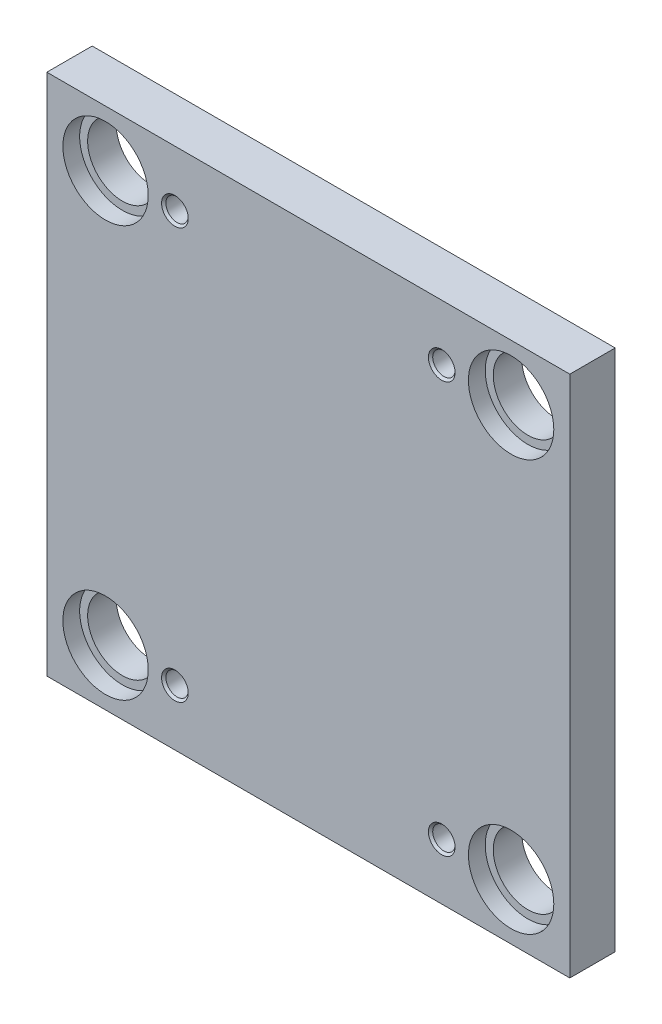
ISO-10303-21;
HEADER;
FILE_DESCRIPTION(('STEP AP214'),'2;1');
FILE_NAME('part.step','',(''),(''),'','','');
FILE_SCHEMA(('AUTOMOTIVE_DESIGN { 1 0 10303 214 1 1 1 1 }'));
ENDSEC;
DATA;
#1=APPLICATION_CONTEXT('core data for automotive mechanical design processes');
#2=APPLICATION_PROTOCOL_DEFINITION('international standard','automotive_design',2000,#1);
#3=PRODUCT_CONTEXT('',#1,'mechanical');
#4=PRODUCT('Part','Part','',(#3));
#5=PRODUCT_RELATED_PRODUCT_CATEGORY('part','',(#4));
#6=PRODUCT_DEFINITION_FORMATION('','',#4);
#7=PRODUCT_DEFINITION_CONTEXT('part definition',#1,'design');
#8=PRODUCT_DEFINITION('design','',#6,#7);
#9=PRODUCT_DEFINITION_SHAPE('','',#8);
#10=(LENGTH_UNIT() NAMED_UNIT(*) SI_UNIT(.MILLI.,.METRE.));
#11=(NAMED_UNIT(*) PLANE_ANGLE_UNIT() SI_UNIT($,.RADIAN.));
#12=(NAMED_UNIT(*) SI_UNIT($,.STERADIAN.) SOLID_ANGLE_UNIT());
#13=UNCERTAINTY_MEASURE_WITH_UNIT(LENGTH_MEASURE(1.E-05),#10,'distance_accuracy_value','');
#14=(GEOMETRIC_REPRESENTATION_CONTEXT(3) GLOBAL_UNCERTAINTY_ASSIGNED_CONTEXT((#13)) GLOBAL_UNIT_ASSIGNED_CONTEXT((#10,
#11,#12)) REPRESENTATION_CONTEXT('',''));
#15=CARTESIAN_POINT('',(0.,0.,0.));
#16=DIRECTION('',(0.,0.,1.));
#17=DIRECTION('',(1.,0.,0.));
#18=AXIS2_PLACEMENT_3D('',#15,#16,#17);
#19=CARTESIAN_POINT('',(98.,-98.,0.));
#20=DIRECTION('',(1.,0.,0.));
#21=DIRECTION('',(0.,0.,-1.));
#22=AXIS2_PLACEMENT_3D('',#19,#20,#21);
#23=PLANE('',#22);
#24=DIRECTION('',(0.,1.,0.));
#25=VECTOR('',#24,1.);
#26=CARTESIAN_POINT('',(98.,-98.,17.));
#27=LINE('',#26,#25);
#28=CARTESIAN_POINT('',(98.,-98.,17.));
#29=VERTEX_POINT('',#28);
#30=CARTESIAN_POINT('',(98.,98.,17.));
#31=VERTEX_POINT('',#30);
#32=EDGE_CURVE('E109',#29,#31,#27,.T.);
#33=ORIENTED_EDGE('',*,*,#32,.F.);
#34=DIRECTION('',(0.,0.,1.));
#35=VECTOR('',#34,1.);
#36=CARTESIAN_POINT('',(98.,-98.,0.));
#37=LINE('',#36,#35);
#38=CARTESIAN_POINT('',(98.,-98.,0.));
#39=VERTEX_POINT('',#38);
#40=EDGE_CURVE('E57',#39,#29,#37,.T.);
#41=ORIENTED_EDGE('',*,*,#40,.F.);
#42=DIRECTION('',(0.,1.,0.));
#43=VECTOR('',#42,1.);
#44=CARTESIAN_POINT('',(98.,-98.,0.));
#45=LINE('',#44,#43);
#46=CARTESIAN_POINT('',(98.,98.,0.));
#47=VERTEX_POINT('',#46);
#48=EDGE_CURVE('E102',#39,#47,#45,.T.);
#49=ORIENTED_EDGE('',*,*,#48,.T.);
#50=DIRECTION('',(0.,0.,1.));
#51=VECTOR('',#50,1.);
#52=CARTESIAN_POINT('',(98.,98.,0.));
#53=LINE('',#52,#51);
#54=EDGE_CURVE('E85',#47,#31,#53,.T.);
#55=ORIENTED_EDGE('',*,*,#54,.T.);
#56=EDGE_LOOP('',(#33,#41,#49,#55));
#57=FACE_BOUND('',#56,.T.);
#58=ADVANCED_FACE('F39',(#57),#23,.T.);
#59=CARTESIAN_POINT('',(-98.,-98.,0.));
#60=DIRECTION('',(0.,-1.,0.));
#61=DIRECTION('',(0.,0.,-1.));
#62=AXIS2_PLACEMENT_3D('',#59,#60,#61);
#63=PLANE('',#62);
#64=DIRECTION('',(1.,0.,0.));
#65=VECTOR('',#64,1.);
#66=CARTESIAN_POINT('',(-98.,-98.,17.));
#67=LINE('',#66,#65);
#68=CARTESIAN_POINT('',(-98.,-98.,17.));
#69=VERTEX_POINT('',#68);
#70=EDGE_CURVE('E104',#69,#29,#67,.T.);
#71=ORIENTED_EDGE('',*,*,#70,.F.);
#72=DIRECTION('',(0.,0.,1.));
#73=VECTOR('',#72,1.);
#74=CARTESIAN_POINT('',(-98.,-98.,0.));
#75=LINE('',#74,#73);
#76=CARTESIAN_POINT('',(-98.,-98.,0.));
#77=VERTEX_POINT('',#76);
#78=EDGE_CURVE('E74',#77,#69,#75,.T.);
#79=ORIENTED_EDGE('',*,*,#78,.F.);
#80=DIRECTION('',(1.,0.,0.));
#81=VECTOR('',#80,1.);
#82=CARTESIAN_POINT('',(-98.,-98.,0.));
#83=LINE('',#82,#81);
#84=EDGE_CURVE('E99',#77,#39,#83,.T.);
#85=ORIENTED_EDGE('',*,*,#84,.T.);
#86=ORIENTED_EDGE('',*,*,#40,.T.);
#87=EDGE_LOOP('',(#71,#79,#85,#86));
#88=FACE_BOUND('',#87,.T.);
#89=ADVANCED_FACE('F159',(#88),#63,.T.);
#90=CARTESIAN_POINT('',(-98.,98.,0.));
#91=DIRECTION('',(-1.,0.,0.));
#92=DIRECTION('',(0.,0.,1.));
#93=AXIS2_PLACEMENT_3D('',#90,#91,#92);
#94=PLANE('',#93);
#95=DIRECTION('',(0.,-1.,0.));
#96=VECTOR('',#95,1.);
#97=CARTESIAN_POINT('',(-98.,98.,17.));
#98=LINE('',#97,#96);
#99=CARTESIAN_POINT('',(-98.,98.,17.));
#100=VERTEX_POINT('',#99);
#101=EDGE_CURVE('E93',#100,#69,#98,.T.);
#102=ORIENTED_EDGE('',*,*,#101,.F.);
#103=DIRECTION('',(0.,0.,1.));
#104=VECTOR('',#103,1.);
#105=CARTESIAN_POINT('',(-98.,98.,0.));
#106=LINE('',#105,#104);
#107=CARTESIAN_POINT('',(-98.,98.,0.));
#108=VERTEX_POINT('',#107);
#109=EDGE_CURVE('E88',#108,#100,#106,.T.);
#110=ORIENTED_EDGE('',*,*,#109,.F.);
#111=DIRECTION('',(0.,-1.,0.));
#112=VECTOR('',#111,1.);
#113=CARTESIAN_POINT('',(-98.,98.,0.));
#114=LINE('',#113,#112);
#115=EDGE_CURVE('E91',#108,#77,#114,.T.);
#116=ORIENTED_EDGE('',*,*,#115,.T.);
#117=ORIENTED_EDGE('',*,*,#78,.T.);
#118=EDGE_LOOP('',(#102,#110,#116,#117));
#119=FACE_BOUND('',#118,.T.);
#120=ADVANCED_FACE('F90',(#119),#94,.T.);
#121=CARTESIAN_POINT('',(98.,98.,0.));
#122=DIRECTION('',(0.,1.,0.));
#123=DIRECTION('',(0.,0.,1.));
#124=AXIS2_PLACEMENT_3D('',#121,#122,#123);
#125=PLANE('',#124);
#126=DIRECTION('',(-1.,0.,0.));
#127=VECTOR('',#126,1.);
#128=CARTESIAN_POINT('',(98.,98.,17.));
#129=LINE('',#128,#127);
#130=EDGE_CURVE('E112',#31,#100,#129,.T.);
#131=ORIENTED_EDGE('',*,*,#130,.F.);
#132=ORIENTED_EDGE('',*,*,#54,.F.);
#133=DIRECTION('',(-1.,0.,0.));
#134=VECTOR('',#133,1.);
#135=CARTESIAN_POINT('',(98.,98.,0.));
#136=LINE('',#135,#134);
#137=EDGE_CURVE('E98',#47,#108,#136,.T.);
#138=ORIENTED_EDGE('',*,*,#137,.T.);
#139=ORIENTED_EDGE('',*,*,#109,.T.);
#140=EDGE_LOOP('',(#131,#132,#138,#139));
#141=FACE_BOUND('',#140,.T.);
#142=ADVANCED_FACE('F101',(#141),#125,.T.);
#143=CARTESIAN_POINT('',(0.,0.,0.));
#144=DIRECTION('',(0.,0.,1.));
#145=DIRECTION('',(1.,0.,0.));
#146=AXIS2_PLACEMENT_3D('',#143,#144,#145);
#147=PLANE('',#146);
#148=CARTESIAN_POINT('',(76.,-77.,0.));
#149=DIRECTION('',(0.,0.,1.));
#150=DIRECTION('',(1.,0.,0.));
#151=AXIS2_PLACEMENT_3D('',#148,#149,#150);
#152=CIRCLE('',#151,13.);
#153=CARTESIAN_POINT('',(89.,-77.,0.));
#154=VERTEX_POINT('',#153);
#155=EDGE_CURVE('E246',#154,#154,#152,.T.);
#156=ORIENTED_EDGE('',*,*,#155,.T.);
#157=EDGE_LOOP('',(#156));
#158=FACE_BOUND('',#157,.T.);
#159=CARTESIAN_POINT('',(-76.,-77.,0.));
#160=DIRECTION('',(0.,0.,1.));
#161=DIRECTION('',(1.,0.,0.));
#162=AXIS2_PLACEMENT_3D('',#159,#160,#161);
#163=CIRCLE('',#162,13.);
#164=CARTESIAN_POINT('',(-63.,-77.,0.));
#165=VERTEX_POINT('',#164);
#166=EDGE_CURVE('E234',#165,#165,#163,.T.);
#167=ORIENTED_EDGE('',*,*,#166,.T.);
#168=EDGE_LOOP('',(#167));
#169=FACE_BOUND('',#168,.T.);
#170=CARTESIAN_POINT('',(76.,77.,0.));
#171=DIRECTION('',(0.,0.,1.));
#172=DIRECTION('',(1.,0.,0.));
#173=AXIS2_PLACEMENT_3D('',#170,#171,#172);
#174=CIRCLE('',#173,13.);
#175=CARTESIAN_POINT('',(89.,77.,0.));
#176=VERTEX_POINT('',#175);
#177=EDGE_CURVE('E222',#176,#176,#174,.T.);
#178=ORIENTED_EDGE('',*,*,#177,.T.);
#179=EDGE_LOOP('',(#178));
#180=FACE_BOUND('',#179,.T.);
#181=CARTESIAN_POINT('',(-76.,77.,0.));
#182=DIRECTION('',(0.,0.,1.));
#183=DIRECTION('',(1.,0.,0.));
#184=AXIS2_PLACEMENT_3D('',#181,#182,#183);
#185=CIRCLE('',#184,13.);
#186=CARTESIAN_POINT('',(-63.,77.,0.));
#187=VERTEX_POINT('',#186);
#188=EDGE_CURVE('E210',#187,#187,#185,.T.);
#189=ORIENTED_EDGE('',*,*,#188,.T.);
#190=EDGE_LOOP('',(#189));
#191=FACE_BOUND('',#190,.T.);
#192=CARTESIAN_POINT('',(-50.,77.,0.));
#193=DIRECTION('',(0.,0.,1.));
#194=DIRECTION('',(1.,0.,0.));
#195=AXIS2_PLACEMENT_3D('',#192,#193,#194);
#196=CIRCLE('',#195,4.18800000000002);
#197=CARTESIAN_POINT('',(-45.812,77.,0.));
#198=VERTEX_POINT('',#197);
#199=EDGE_CURVE('E207',#198,#198,#196,.T.);
#200=ORIENTED_EDGE('',*,*,#199,.T.);
#201=EDGE_LOOP('',(#200));
#202=FACE_BOUND('',#201,.T.);
#203=CARTESIAN_POINT('',(-50.,-77.,0.));
#204=DIRECTION('',(0.,0.,1.));
#205=DIRECTION('',(1.,0.,0.));
#206=AXIS2_PLACEMENT_3D('',#203,#204,#205);
#207=CIRCLE('',#206,4.18800000000002);
#208=CARTESIAN_POINT('',(-45.812,-77.,0.));
#209=VERTEX_POINT('',#208);
#210=EDGE_CURVE('E202',#209,#209,#207,.T.);
#211=ORIENTED_EDGE('',*,*,#210,.T.);
#212=EDGE_LOOP('',(#211));
#213=FACE_BOUND('',#212,.T.);
#214=CARTESIAN_POINT('',(50.,77.,0.));
#215=DIRECTION('',(0.,0.,1.));
#216=DIRECTION('',(1.,0.,0.));
#217=AXIS2_PLACEMENT_3D('',#214,#215,#216);
#218=CIRCLE('',#217,4.18800000000002);
#219=CARTESIAN_POINT('',(54.188,77.,0.));
#220=VERTEX_POINT('',#219);
#221=EDGE_CURVE('E200',#220,#220,#218,.T.);
#222=ORIENTED_EDGE('',*,*,#221,.T.);
#223=EDGE_LOOP('',(#222));
#224=FACE_BOUND('',#223,.T.);
#225=CARTESIAN_POINT('',(50.,-77.,0.));
#226=DIRECTION('',(0.,0.,1.));
#227=DIRECTION('',(1.,0.,0.));
#228=AXIS2_PLACEMENT_3D('',#225,#226,#227);
#229=CIRCLE('',#228,4.18800000000002);
#230=CARTESIAN_POINT('',(54.188,-77.,0.));
#231=VERTEX_POINT('',#230);
#232=EDGE_CURVE('E113',#231,#231,#229,.T.);
#233=ORIENTED_EDGE('',*,*,#232,.T.);
#234=EDGE_LOOP('',(#233));
#235=FACE_BOUND('',#234,.T.);
#236=ORIENTED_EDGE('',*,*,#48,.F.);
#237=ORIENTED_EDGE('',*,*,#84,.F.);
#238=ORIENTED_EDGE('',*,*,#115,.F.);
#239=ORIENTED_EDGE('',*,*,#137,.F.);
#240=EDGE_LOOP('',(#236,#237,#238,#239));
#241=FACE_BOUND('',#240,.T.);
#242=ADVANCED_FACE('F97',(#158,#169,#180,#191,#202,#213,#224,#235,#241),#147,.F.);
#243=CARTESIAN_POINT('',(0.,0.,17.));
#244=DIRECTION('',(0.,0.,1.));
#245=DIRECTION('',(1.,0.,0.));
#246=AXIS2_PLACEMENT_3D('',#243,#244,#245);
#247=PLANE('',#246);
#248=CARTESIAN_POINT('',(50.,-77.,17.));
#249=DIRECTION('',(0.,0.,1.));
#250=DIRECTION('',(1.,0.,0.));
#251=AXIS2_PLACEMENT_3D('',#248,#249,#250);
#252=CIRCLE('',#251,5.00000000000003);
#253=CARTESIAN_POINT('',(55.,-77.,17.));
#254=VERTEX_POINT('',#253);
#255=EDGE_CURVE('E133',#254,#254,#252,.F.);
#256=ORIENTED_EDGE('',*,*,#255,.T.);
#257=EDGE_LOOP('',(#256));
#258=FACE_BOUND('',#257,.T.);
#259=CARTESIAN_POINT('',(50.,77.,17.));
#260=DIRECTION('',(0.,0.,1.));
#261=DIRECTION('',(1.,0.,0.));
#262=AXIS2_PLACEMENT_3D('',#259,#260,#261);
#263=CIRCLE('',#262,5.00000000000003);
#264=CARTESIAN_POINT('',(55.,77.,17.));
#265=VERTEX_POINT('',#264);
#266=EDGE_CURVE('E130',#265,#265,#263,.F.);
#267=ORIENTED_EDGE('',*,*,#266,.T.);
#268=EDGE_LOOP('',(#267));
#269=FACE_BOUND('',#268,.T.);
#270=CARTESIAN_POINT('',(-50.,77.,17.));
#271=DIRECTION('',(0.,0.,1.));
#272=DIRECTION('',(1.,0.,0.));
#273=AXIS2_PLACEMENT_3D('',#270,#271,#272);
#274=CIRCLE('',#273,5.00000000000003);
#275=CARTESIAN_POINT('',(-45.,77.,17.));
#276=VERTEX_POINT('',#275);
#277=EDGE_CURVE('E127',#276,#276,#274,.F.);
#278=ORIENTED_EDGE('',*,*,#277,.T.);
#279=EDGE_LOOP('',(#278));
#280=FACE_BOUND('',#279,.T.);
#281=CARTESIAN_POINT('',(-50.,-77.,17.));
#282=DIRECTION('',(0.,0.,1.));
#283=DIRECTION('',(1.,0.,0.));
#284=AXIS2_PLACEMENT_3D('',#281,#282,#283);
#285=CIRCLE('',#284,5.00000000000003);
#286=CARTESIAN_POINT('',(-45.,-77.,17.));
#287=VERTEX_POINT('',#286);
#288=EDGE_CURVE('E124',#287,#287,#285,.F.);
#289=ORIENTED_EDGE('',*,*,#288,.T.);
#290=EDGE_LOOP('',(#289));
#291=FACE_BOUND('',#290,.T.);
#292=CARTESIAN_POINT('',(76.,-77.,17.));
#293=DIRECTION('',(0.,0.,1.));
#294=DIRECTION('',(1.,0.,0.));
#295=AXIS2_PLACEMENT_3D('',#292,#293,#294);
#296=CIRCLE('',#295,16.);
#297=CARTESIAN_POINT('',(92.,-77.,17.));
#298=VERTEX_POINT('',#297);
#299=EDGE_CURVE('E255',#298,#298,#296,.T.);
#300=ORIENTED_EDGE('',*,*,#299,.F.);
#301=EDGE_LOOP('',(#300));
#302=FACE_BOUND('',#301,.T.);
#303=CARTESIAN_POINT('',(-76.,-77.,17.));
#304=DIRECTION('',(0.,0.,1.));
#305=DIRECTION('',(1.,0.,0.));
#306=AXIS2_PLACEMENT_3D('',#303,#304,#305);
#307=CIRCLE('',#306,16.);
#308=CARTESIAN_POINT('',(-60.,-77.,17.));
#309=VERTEX_POINT('',#308);
#310=EDGE_CURVE('E243',#309,#309,#307,.T.);
#311=ORIENTED_EDGE('',*,*,#310,.F.);
#312=EDGE_LOOP('',(#311));
#313=FACE_BOUND('',#312,.T.);
#314=CARTESIAN_POINT('',(76.,77.,17.));
#315=DIRECTION('',(0.,0.,1.));
#316=DIRECTION('',(1.,0.,0.));
#317=AXIS2_PLACEMENT_3D('',#314,#315,#316);
#318=CIRCLE('',#317,16.);
#319=CARTESIAN_POINT('',(92.,77.,17.));
#320=VERTEX_POINT('',#319);
#321=EDGE_CURVE('E231',#320,#320,#318,.T.);
#322=ORIENTED_EDGE('',*,*,#321,.F.);
#323=EDGE_LOOP('',(#322));
#324=FACE_BOUND('',#323,.T.);
#325=CARTESIAN_POINT('',(-76.,77.,17.));
#326=DIRECTION('',(0.,0.,1.));
#327=DIRECTION('',(1.,0.,0.));
#328=AXIS2_PLACEMENT_3D('',#325,#326,#327);
#329=CIRCLE('',#328,16.);
#330=CARTESIAN_POINT('',(-60.,77.,17.));
#331=VERTEX_POINT('',#330);
#332=EDGE_CURVE('E219',#331,#331,#329,.T.);
#333=ORIENTED_EDGE('',*,*,#332,.F.);
#334=EDGE_LOOP('',(#333));
#335=FACE_BOUND('',#334,.T.);
#336=ORIENTED_EDGE('',*,*,#32,.T.);
#337=ORIENTED_EDGE('',*,*,#130,.T.);
#338=ORIENTED_EDGE('',*,*,#101,.T.);
#339=ORIENTED_EDGE('',*,*,#70,.T.);
#340=EDGE_LOOP('',(#336,#337,#338,#339));
#341=FACE_BOUND('',#340,.T.);
#342=ADVANCED_FACE('F195',(#258,#269,#280,#291,#302,#313,#324,#335,#341),#247,.T.);
#343=CARTESIAN_POINT('',(50.,-77.,17.));
#344=DIRECTION('',(0.,0.,1.));
#345=DIRECTION('',(1.,0.,0.));
#346=AXIS2_PLACEMENT_3D('',#343,#344,#345);
#347=CYLINDRICAL_SURFACE('',#346,4.18800000000002);
#348=CARTESIAN_POINT('',(50.,-77.,16.188));
#349=DIRECTION('',(0.,0.,1.));
#350=DIRECTION('',(1.,0.,0.));
#351=AXIS2_PLACEMENT_3D('',#348,#349,#350);
#352=CIRCLE('',#351,4.18800000000002);
#353=CARTESIAN_POINT('',(54.188,-77.,16.188));
#354=VERTEX_POINT('',#353);
#355=EDGE_CURVE('E119',#354,#354,#352,.T.);
#356=ORIENTED_EDGE('',*,*,#355,.T.);
#357=EDGE_LOOP('',(#356));
#358=FACE_BOUND('',#357,.T.);
#359=ORIENTED_EDGE('',*,*,#232,.F.);
#360=EDGE_LOOP('',(#359));
#361=FACE_BOUND('',#360,.T.);
#362=ADVANCED_FACE('F191',(#358,#361),#347,.F.);
#363=CARTESIAN_POINT('',(50.,77.,17.));
#364=DIRECTION('',(0.,0.,1.));
#365=DIRECTION('',(1.,0.,0.));
#366=AXIS2_PLACEMENT_3D('',#363,#364,#365);
#367=CYLINDRICAL_SURFACE('',#366,4.18800000000002);
#368=CARTESIAN_POINT('',(50.,77.,16.188));
#369=DIRECTION('',(0.,0.,1.));
#370=DIRECTION('',(1.,0.,0.));
#371=AXIS2_PLACEMENT_3D('',#368,#369,#370);
#372=CIRCLE('',#371,4.18800000000002);
#373=CARTESIAN_POINT('',(54.188,77.,16.188));
#374=VERTEX_POINT('',#373);
#375=EDGE_CURVE('E136',#374,#374,#372,.T.);
#376=ORIENTED_EDGE('',*,*,#375,.T.);
#377=EDGE_LOOP('',(#376));
#378=FACE_BOUND('',#377,.T.);
#379=ORIENTED_EDGE('',*,*,#221,.F.);
#380=EDGE_LOOP('',(#379));
#381=FACE_BOUND('',#380,.T.);
#382=ADVANCED_FACE('F194',(#378,#381),#367,.F.);
#383=CARTESIAN_POINT('',(-50.,-77.,17.));
#384=DIRECTION('',(0.,0.,1.));
#385=DIRECTION('',(1.,0.,0.));
#386=AXIS2_PLACEMENT_3D('',#383,#384,#385);
#387=CYLINDRICAL_SURFACE('',#386,4.18800000000002);
#388=CARTESIAN_POINT('',(-50.,-77.,16.188));
#389=DIRECTION('',(0.,0.,1.));
#390=DIRECTION('',(1.,0.,0.));
#391=AXIS2_PLACEMENT_3D('',#388,#389,#390);
#392=CIRCLE('',#391,4.18800000000002);
#393=CARTESIAN_POINT('',(-45.812,-77.,16.188));
#394=VERTEX_POINT('',#393);
#395=EDGE_CURVE('E11',#394,#394,#392,.T.);
#396=ORIENTED_EDGE('',*,*,#395,.T.);
#397=EDGE_LOOP('',(#396));
#398=FACE_BOUND('',#397,.T.);
#399=ORIENTED_EDGE('',*,*,#210,.F.);
#400=EDGE_LOOP('',(#399));
#401=FACE_BOUND('',#400,.T.);
#402=ADVANCED_FACE('F295',(#398,#401),#387,.F.);
#403=CARTESIAN_POINT('',(-50.,77.,17.));
#404=DIRECTION('',(0.,0.,1.));
#405=DIRECTION('',(1.,0.,0.));
#406=AXIS2_PLACEMENT_3D('',#403,#404,#405);
#407=CYLINDRICAL_SURFACE('',#406,4.18800000000002);
#408=CARTESIAN_POINT('',(-50.,77.,16.188));
#409=DIRECTION('',(0.,0.,1.));
#410=DIRECTION('',(1.,0.,0.));
#411=AXIS2_PLACEMENT_3D('',#408,#409,#410);
#412=CIRCLE('',#411,4.18800000000002);
#413=CARTESIAN_POINT('',(-45.812,77.,16.188));
#414=VERTEX_POINT('',#413);
#415=EDGE_CURVE('E49',#414,#414,#412,.T.);
#416=ORIENTED_EDGE('',*,*,#415,.T.);
#417=EDGE_LOOP('',(#416));
#418=FACE_BOUND('',#417,.T.);
#419=ORIENTED_EDGE('',*,*,#199,.F.);
#420=EDGE_LOOP('',(#419));
#421=FACE_BOUND('',#420,.T.);
#422=ADVANCED_FACE('F141',(#418,#421),#407,.F.);
#423=CARTESIAN_POINT('',(-76.,77.,17.));
#424=DIRECTION('',(0.,0.,1.));
#425=DIRECTION('',(1.,0.,0.));
#426=AXIS2_PLACEMENT_3D('',#423,#424,#425);
#427=CYLINDRICAL_SURFACE('',#426,13.);
#428=ORIENTED_EDGE('',*,*,#188,.F.);
#429=EDGE_LOOP('',(#428));
#430=FACE_BOUND('',#429,.T.);
#431=CARTESIAN_POINT('',(-76.,77.,10.7));
#432=DIRECTION('',(0.,0.,1.));
#433=DIRECTION('',(1.,0.,0.));
#434=AXIS2_PLACEMENT_3D('',#431,#432,#433);
#435=CIRCLE('',#434,13.);
#436=CARTESIAN_POINT('',(-63.,77.,10.7));
#437=VERTEX_POINT('',#436);
#438=EDGE_CURVE('E213',#437,#437,#435,.T.);
#439=ORIENTED_EDGE('',*,*,#438,.T.);
#440=EDGE_LOOP('',(#439));
#441=FACE_BOUND('',#440,.T.);
#442=ADVANCED_FACE('F284',(#430,#441),#427,.F.);
#443=CARTESIAN_POINT('',(-63.,77.,10.7));
#444=DIRECTION('',(0.,0.,-1.));
#445=DIRECTION('',(-1.,0.,0.));
#446=AXIS2_PLACEMENT_3D('',#443,#444,#445);
#447=PLANE('',#446);
#448=ORIENTED_EDGE('',*,*,#438,.F.);
#449=EDGE_LOOP('',(#448));
#450=FACE_BOUND('',#449,.T.);
#451=CARTESIAN_POINT('',(-76.,77.,10.7));
#452=DIRECTION('',(0.,0.,1.));
#453=DIRECTION('',(1.,0.,0.));
#454=AXIS2_PLACEMENT_3D('',#451,#452,#453);
#455=CIRCLE('',#454,16.);
#456=CARTESIAN_POINT('',(-60.,77.,10.7));
#457=VERTEX_POINT('',#456);
#458=EDGE_CURVE('E216',#457,#457,#455,.T.);
#459=ORIENTED_EDGE('',*,*,#458,.T.);
#460=EDGE_LOOP('',(#459));
#461=FACE_BOUND('',#460,.T.);
#462=ADVANCED_FACE('F274',(#450,#461),#447,.F.);
#463=CARTESIAN_POINT('',(-76.,77.,17.));
#464=DIRECTION('',(0.,0.,1.));
#465=DIRECTION('',(1.,0.,0.));
#466=AXIS2_PLACEMENT_3D('',#463,#464,#465);
#467=CYLINDRICAL_SURFACE('',#466,16.);
#468=ORIENTED_EDGE('',*,*,#458,.F.);
#469=EDGE_LOOP('',(#468));
#470=FACE_BOUND('',#469,.T.);
#471=ORIENTED_EDGE('',*,*,#332,.T.);
#472=EDGE_LOOP('',(#471));
#473=FACE_BOUND('',#472,.T.);
#474=ADVANCED_FACE('F271',(#470,#473),#467,.F.);
#475=CARTESIAN_POINT('',(76.,77.,17.));
#476=DIRECTION('',(0.,0.,1.));
#477=DIRECTION('',(1.,0.,0.));
#478=AXIS2_PLACEMENT_3D('',#475,#476,#477);
#479=CYLINDRICAL_SURFACE('',#478,13.);
#480=ORIENTED_EDGE('',*,*,#177,.F.);
#481=EDGE_LOOP('',(#480));
#482=FACE_BOUND('',#481,.T.);
#483=CARTESIAN_POINT('',(76.,77.,10.7));
#484=DIRECTION('',(0.,0.,1.));
#485=DIRECTION('',(1.,0.,0.));
#486=AXIS2_PLACEMENT_3D('',#483,#484,#485);
#487=CIRCLE('',#486,13.);
#488=CARTESIAN_POINT('',(89.,77.,10.7));
#489=VERTEX_POINT('',#488);
#490=EDGE_CURVE('E225',#489,#489,#487,.T.);
#491=ORIENTED_EDGE('',*,*,#490,.T.);
#492=EDGE_LOOP('',(#491));
#493=FACE_BOUND('',#492,.T.);
#494=ADVANCED_FACE('F273',(#482,#493),#479,.F.);
#495=CARTESIAN_POINT('',(89.,77.,10.7));
#496=DIRECTION('',(0.,0.,-1.));
#497=DIRECTION('',(-1.,0.,0.));
#498=AXIS2_PLACEMENT_3D('',#495,#496,#497);
#499=PLANE('',#498);
#500=ORIENTED_EDGE('',*,*,#490,.F.);
#501=EDGE_LOOP('',(#500));
#502=FACE_BOUND('',#501,.T.);
#503=CARTESIAN_POINT('',(76.,77.,10.7));
#504=DIRECTION('',(0.,0.,1.));
#505=DIRECTION('',(1.,0.,0.));
#506=AXIS2_PLACEMENT_3D('',#503,#504,#505);
#507=CIRCLE('',#506,16.);
#508=CARTESIAN_POINT('',(92.,77.,10.7));
#509=VERTEX_POINT('',#508);
#510=EDGE_CURVE('E228',#509,#509,#507,.T.);
#511=ORIENTED_EDGE('',*,*,#510,.T.);
#512=EDGE_LOOP('',(#511));
#513=FACE_BOUND('',#512,.T.);
#514=ADVANCED_FACE('F281',(#502,#513),#499,.F.);
#515=CARTESIAN_POINT('',(76.,77.,17.));
#516=DIRECTION('',(0.,0.,1.));
#517=DIRECTION('',(1.,0.,0.));
#518=AXIS2_PLACEMENT_3D('',#515,#516,#517);
#519=CYLINDRICAL_SURFACE('',#518,16.);
#520=ORIENTED_EDGE('',*,*,#510,.F.);
#521=EDGE_LOOP('',(#520));
#522=FACE_BOUND('',#521,.T.);
#523=ORIENTED_EDGE('',*,*,#321,.T.);
#524=EDGE_LOOP('',(#523));
#525=FACE_BOUND('',#524,.T.);
#526=ADVANCED_FACE('F362',(#522,#525),#519,.F.);
#527=CARTESIAN_POINT('',(-76.,-77.,17.));
#528=DIRECTION('',(0.,0.,1.));
#529=DIRECTION('',(1.,0.,0.));
#530=AXIS2_PLACEMENT_3D('',#527,#528,#529);
#531=CYLINDRICAL_SURFACE('',#530,13.);
#532=ORIENTED_EDGE('',*,*,#166,.F.);
#533=EDGE_LOOP('',(#532));
#534=FACE_BOUND('',#533,.T.);
#535=CARTESIAN_POINT('',(-76.,-77.,10.7));
#536=DIRECTION('',(0.,0.,1.));
#537=DIRECTION('',(1.,0.,0.));
#538=AXIS2_PLACEMENT_3D('',#535,#536,#537);
#539=CIRCLE('',#538,13.);
#540=CARTESIAN_POINT('',(-63.,-77.,10.7));
#541=VERTEX_POINT('',#540);
#542=EDGE_CURVE('E237',#541,#541,#539,.T.);
#543=ORIENTED_EDGE('',*,*,#542,.T.);
#544=EDGE_LOOP('',(#543));
#545=FACE_BOUND('',#544,.T.);
#546=ADVANCED_FACE('F371',(#534,#545),#531,.F.);
#547=CARTESIAN_POINT('',(-63.,-77.,10.7));
#548=DIRECTION('',(0.,0.,-1.));
#549=DIRECTION('',(-1.,0.,0.));
#550=AXIS2_PLACEMENT_3D('',#547,#548,#549);
#551=PLANE('',#550);
#552=ORIENTED_EDGE('',*,*,#542,.F.);
#553=EDGE_LOOP('',(#552));
#554=FACE_BOUND('',#553,.T.);
#555=CARTESIAN_POINT('',(-76.,-77.,10.7));
#556=DIRECTION('',(0.,0.,1.));
#557=DIRECTION('',(1.,0.,0.));
#558=AXIS2_PLACEMENT_3D('',#555,#556,#557);
#559=CIRCLE('',#558,16.);
#560=CARTESIAN_POINT('',(-60.,-77.,10.7));
#561=VERTEX_POINT('',#560);
#562=EDGE_CURVE('E240',#561,#561,#559,.T.);
#563=ORIENTED_EDGE('',*,*,#562,.T.);
#564=EDGE_LOOP('',(#563));
#565=FACE_BOUND('',#564,.T.);
#566=ADVANCED_FACE('F381',(#554,#565),#551,.F.);
#567=CARTESIAN_POINT('',(-76.,-77.,17.));
#568=DIRECTION('',(0.,0.,1.));
#569=DIRECTION('',(1.,0.,0.));
#570=AXIS2_PLACEMENT_3D('',#567,#568,#569);
#571=CYLINDRICAL_SURFACE('',#570,16.);
#572=ORIENTED_EDGE('',*,*,#562,.F.);
#573=EDGE_LOOP('',(#572));
#574=FACE_BOUND('',#573,.T.);
#575=ORIENTED_EDGE('',*,*,#310,.T.);
#576=EDGE_LOOP('',(#575));
#577=FACE_BOUND('',#576,.T.);
#578=ADVANCED_FACE('F391',(#574,#577),#571,.F.);
#579=CARTESIAN_POINT('',(76.,-77.,17.));
#580=DIRECTION('',(0.,0.,1.));
#581=DIRECTION('',(1.,0.,0.));
#582=AXIS2_PLACEMENT_3D('',#579,#580,#581);
#583=CYLINDRICAL_SURFACE('',#582,13.);
#584=ORIENTED_EDGE('',*,*,#155,.F.);
#585=EDGE_LOOP('',(#584));
#586=FACE_BOUND('',#585,.T.);
#587=CARTESIAN_POINT('',(76.,-77.,10.7));
#588=DIRECTION('',(0.,0.,1.));
#589=DIRECTION('',(1.,0.,0.));
#590=AXIS2_PLACEMENT_3D('',#587,#588,#589);
#591=CIRCLE('',#590,13.);
#592=CARTESIAN_POINT('',(89.,-77.,10.7));
#593=VERTEX_POINT('',#592);
#594=EDGE_CURVE('E249',#593,#593,#591,.T.);
#595=ORIENTED_EDGE('',*,*,#594,.T.);
#596=EDGE_LOOP('',(#595));
#597=FACE_BOUND('',#596,.T.);
#598=ADVANCED_FACE('F401',(#586,#597),#583,.F.);
#599=CARTESIAN_POINT('',(89.,-77.,10.7));
#600=DIRECTION('',(0.,0.,-1.));
#601=DIRECTION('',(-1.,0.,0.));
#602=AXIS2_PLACEMENT_3D('',#599,#600,#601);
#603=PLANE('',#602);
#604=ORIENTED_EDGE('',*,*,#594,.F.);
#605=EDGE_LOOP('',(#604));
#606=FACE_BOUND('',#605,.T.);
#607=CARTESIAN_POINT('',(76.,-77.,10.7));
#608=DIRECTION('',(0.,0.,1.));
#609=DIRECTION('',(1.,0.,0.));
#610=AXIS2_PLACEMENT_3D('',#607,#608,#609);
#611=CIRCLE('',#610,16.);
#612=CARTESIAN_POINT('',(92.,-77.,10.7));
#613=VERTEX_POINT('',#612);
#614=EDGE_CURVE('E252',#613,#613,#611,.T.);
#615=ORIENTED_EDGE('',*,*,#614,.T.);
#616=EDGE_LOOP('',(#615));
#617=FACE_BOUND('',#616,.T.);
#618=ADVANCED_FACE('F184',(#606,#617),#603,.F.);
#619=CARTESIAN_POINT('',(76.,-77.,17.));
#620=DIRECTION('',(0.,0.,1.));
#621=DIRECTION('',(1.,0.,0.));
#622=AXIS2_PLACEMENT_3D('',#619,#620,#621);
#623=CYLINDRICAL_SURFACE('',#622,16.);
#624=ORIENTED_EDGE('',*,*,#614,.F.);
#625=EDGE_LOOP('',(#624));
#626=FACE_BOUND('',#625,.T.);
#627=ORIENTED_EDGE('',*,*,#299,.T.);
#628=EDGE_LOOP('',(#627));
#629=FACE_BOUND('',#628,.T.);
#630=ADVANCED_FACE('F173',(#626,#629),#623,.F.);
#631=CARTESIAN_POINT('',(50.,-77.,16.188));
#632=DIRECTION('',(0.,0.,1.));
#633=DIRECTION('',(1.,0.,0.));
#634=AXIS2_PLACEMENT_3D('',#631,#632,#633);
#635=CONICAL_SURFACE('',#634,4.18800000000002,0.785398163397444);
#636=ORIENTED_EDGE('',*,*,#255,.F.);
#637=EDGE_LOOP('',(#636));
#638=FACE_BOUND('',#637,.T.);
#639=ORIENTED_EDGE('',*,*,#355,.F.);
#640=EDGE_LOOP('',(#639));
#641=FACE_BOUND('',#640,.T.);
#642=ADVANCED_FACE('F153',(#638,#641),#635,.F.);
#643=CARTESIAN_POINT('',(50.,77.,16.188));
#644=DIRECTION('',(0.,0.,1.));
#645=DIRECTION('',(1.,0.,0.));
#646=AXIS2_PLACEMENT_3D('',#643,#644,#645);
#647=CONICAL_SURFACE('',#646,4.18800000000002,0.785398163397444);
#648=ORIENTED_EDGE('',*,*,#266,.F.);
#649=EDGE_LOOP('',(#648));
#650=FACE_BOUND('',#649,.T.);
#651=ORIENTED_EDGE('',*,*,#375,.F.);
#652=EDGE_LOOP('',(#651));
#653=FACE_BOUND('',#652,.T.);
#654=ADVANCED_FACE('F146',(#650,#653),#647,.F.);
#655=CARTESIAN_POINT('',(-50.,77.,16.188));
#656=DIRECTION('',(0.,0.,1.));
#657=DIRECTION('',(1.,0.,0.));
#658=AXIS2_PLACEMENT_3D('',#655,#656,#657);
#659=CONICAL_SURFACE('',#658,4.18800000000002,0.785398163397444);
#660=ORIENTED_EDGE('',*,*,#277,.F.);
#661=EDGE_LOOP('',(#660));
#662=FACE_BOUND('',#661,.T.);
#663=ORIENTED_EDGE('',*,*,#415,.F.);
#664=EDGE_LOOP('',(#663));
#665=FACE_BOUND('',#664,.T.);
#666=ADVANCED_FACE('F144',(#662,#665),#659,.F.);
#667=CARTESIAN_POINT('',(-50.,-77.,16.188));
#668=DIRECTION('',(0.,0.,1.));
#669=DIRECTION('',(1.,0.,0.));
#670=AXIS2_PLACEMENT_3D('',#667,#668,#669);
#671=CONICAL_SURFACE('',#670,4.18800000000002,0.785398163397444);
#672=ORIENTED_EDGE('',*,*,#288,.F.);
#673=EDGE_LOOP('',(#672));
#674=FACE_BOUND('',#673,.T.);
#675=ORIENTED_EDGE('',*,*,#395,.F.);
#676=EDGE_LOOP('',(#675));
#677=FACE_BOUND('',#676,.T.);
#678=ADVANCED_FACE('F42',(#674,#677),#671,.F.);
#679=CLOSED_SHELL('',(#58,#89,#120,#142,#242,#342,#362,#382,#402,#422,#442,#462,#474,#494,#514,
#526,#546,#566,#578,#598,#618,#630,#642,#654,#666,#678));
#680=MANIFOLD_SOLID_BREP('B2',#679);
#681=ADVANCED_BREP_SHAPE_REPRESENTATION('',(#18,#680),#14);
#682=SHAPE_DEFINITION_REPRESENTATION(#9,#681);
ENDSEC;
END-ISO-10303-21;
